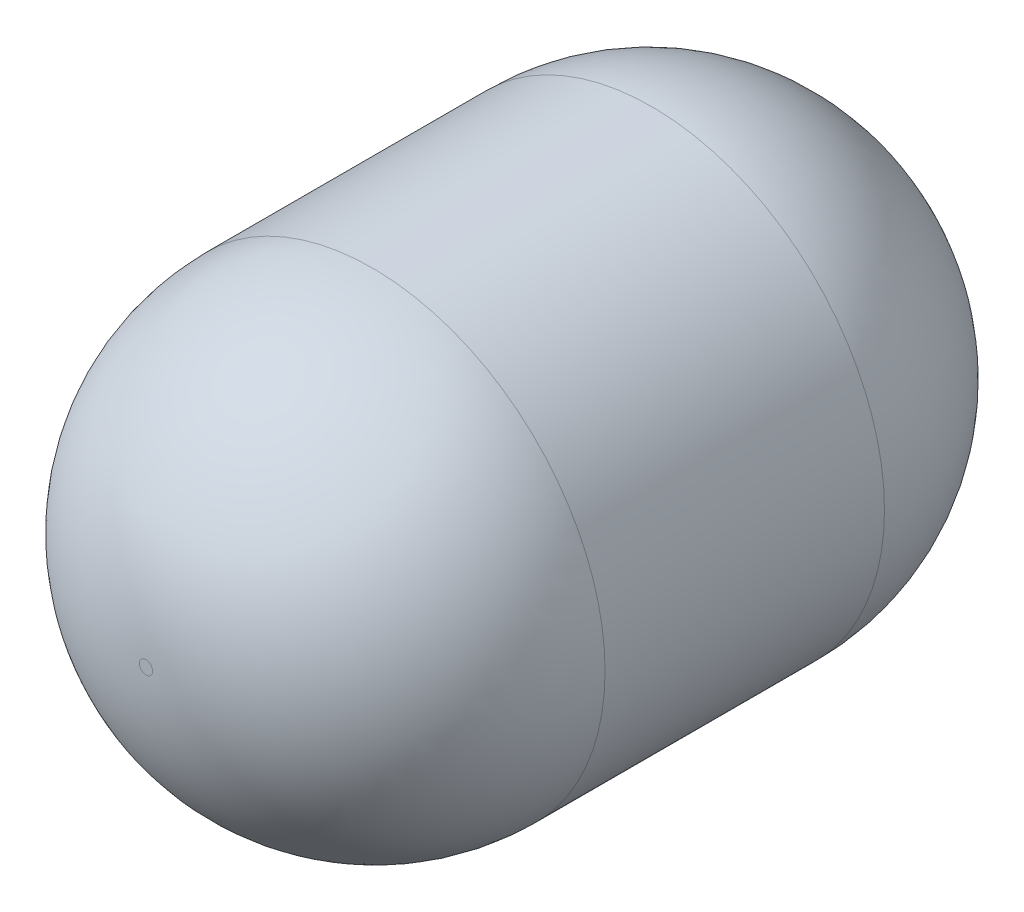
ISO-10303-21;
HEADER;
FILE_DESCRIPTION(('STEP AP214'),'2;1');
FILE_NAME('part.step','',(''),(''),'','','');
FILE_SCHEMA(('AUTOMOTIVE_DESIGN { 1 0 10303 214 1 1 1 1 }'));
ENDSEC;
DATA;
#1=APPLICATION_CONTEXT('core data for automotive mechanical design processes');
#2=APPLICATION_PROTOCOL_DEFINITION('international standard','automotive_design',2000,#1);
#3=PRODUCT_CONTEXT('',#1,'mechanical');
#4=PRODUCT('Part','Part','',(#3));
#5=PRODUCT_RELATED_PRODUCT_CATEGORY('part','',(#4));
#6=PRODUCT_DEFINITION_FORMATION('','',#4);
#7=PRODUCT_DEFINITION_CONTEXT('part definition',#1,'design');
#8=PRODUCT_DEFINITION('design','',#6,#7);
#9=PRODUCT_DEFINITION_SHAPE('','',#8);
#10=(LENGTH_UNIT() NAMED_UNIT(*) SI_UNIT(.MILLI.,.METRE.));
#11=(NAMED_UNIT(*) PLANE_ANGLE_UNIT() SI_UNIT($,.RADIAN.));
#12=(NAMED_UNIT(*) SI_UNIT($,.STERADIAN.) SOLID_ANGLE_UNIT());
#13=UNCERTAINTY_MEASURE_WITH_UNIT(LENGTH_MEASURE(1.E-05),#10,'distance_accuracy_value','');
#14=(GEOMETRIC_REPRESENTATION_CONTEXT(3) GLOBAL_UNCERTAINTY_ASSIGNED_CONTEXT((#13)) GLOBAL_UNIT_ASSIGNED_CONTEXT((#10,
#11,#12)) REPRESENTATION_CONTEXT('',''));
#15=CARTESIAN_POINT('',(0.,0.,0.));
#16=DIRECTION('',(0.,0.,1.));
#17=DIRECTION('',(1.,0.,0.));
#18=AXIS2_PLACEMENT_3D('',#15,#16,#17);
#19=CARTESIAN_POINT('',(0.,0.,110.));
#20=DIRECTION('',(0.,0.,-1.));
#21=DIRECTION('',(-1.,0.,0.));
#22=AXIS2_PLACEMENT_3D('',#19,#20,#21);
#23=CYLINDRICAL_SURFACE('',#22,35.);
#24=CARTESIAN_POINT('',(0.,0.,34.));
#25=DIRECTION('',(0.,0.,1.));
#26=DIRECTION('',(1.,0.,0.));
#27=AXIS2_PLACEMENT_3D('',#24,#25,#26);
#28=CIRCLE('',#27,35.);
#29=CARTESIAN_POINT('',(35.,0.,34.));
#30=VERTEX_POINT('',#29);
#31=EDGE_CURVE('E54',#30,#30,#28,.T.);
#32=ORIENTED_EDGE('',*,*,#31,.T.);
#33=EDGE_LOOP('',(#32));
#34=FACE_BOUND('',#33,.T.);
#35=CARTESIAN_POINT('',(0.,0.,76.));
#36=DIRECTION('',(0.,0.,1.));
#37=DIRECTION('',(1.,0.,0.));
#38=AXIS2_PLACEMENT_3D('',#35,#36,#37);
#39=CIRCLE('',#38,35.);
#40=CARTESIAN_POINT('',(35.,0.,76.));
#41=VERTEX_POINT('',#40);
#42=EDGE_CURVE('E58',#41,#41,#39,.F.);
#43=ORIENTED_EDGE('',*,*,#42,.T.);
#44=EDGE_LOOP('',(#43));
#45=FACE_BOUND('',#44,.T.);
#46=ADVANCED_FACE('F43',(#34,#45),#23,.T.);
#47=CARTESIAN_POINT('',(0.,0.,110.));
#48=DIRECTION('',(0.,0.,1.));
#49=DIRECTION('',(1.,0.,0.));
#50=AXIS2_PLACEMENT_3D('',#47,#48,#49);
#51=PLANE('',#50);
#52=CARTESIAN_POINT('',(0.,0.,110.));
#53=DIRECTION('',(0.,0.,1.));
#54=DIRECTION('',(1.,0.,0.));
#55=AXIS2_PLACEMENT_3D('',#52,#53,#54);
#56=CIRCLE('',#55,1.00000000000001);
#57=CARTESIAN_POINT('',(1.00000000000001,0.,110.));
#58=VERTEX_POINT('',#57);
#59=EDGE_CURVE('E10',#58,#58,#56,.T.);
#60=ORIENTED_EDGE('',*,*,#59,.T.);
#61=EDGE_LOOP('',(#60));
#62=FACE_BOUND('',#61,.T.);
#63=ADVANCED_FACE('F74',(#62),#51,.T.);
#64=CARTESIAN_POINT('',(0.,0.,0.));
#65=DIRECTION('',(0.,0.,1.));
#66=DIRECTION('',(1.,0.,0.));
#67=AXIS2_PLACEMENT_3D('',#64,#65,#66);
#68=PLANE('',#67);
#69=CARTESIAN_POINT('',(0.,0.,0.));
#70=DIRECTION('',(0.,0.,1.));
#71=DIRECTION('',(1.,0.,0.));
#72=AXIS2_PLACEMENT_3D('',#69,#70,#71);
#73=CIRCLE('',#72,1.00000000000001);
#74=CARTESIAN_POINT('',(1.00000000000001,0.,0.));
#75=VERTEX_POINT('',#74);
#76=EDGE_CURVE('E50',#75,#75,#73,.F.);
#77=ORIENTED_EDGE('',*,*,#76,.T.);
#78=EDGE_LOOP('',(#77));
#79=FACE_BOUND('',#78,.T.);
#80=ADVANCED_FACE('F71',(#79),#68,.F.);
#81=CARTESIAN_POINT('',(0.,0.,34.));
#82=DIRECTION('',(0.,0.,1.));
#83=DIRECTION('',(1.,0.,0.));
#84=AXIS2_PLACEMENT_3D('',#81,#82,#83);
#85=DEGENERATE_TOROIDAL_SURFACE('',#84,1.00000000000001,34.,.T.);
#86=ORIENTED_EDGE('',*,*,#76,.F.);
#87=EDGE_LOOP('',(#86));
#88=FACE_BOUND('',#87,.T.);
#89=ORIENTED_EDGE('',*,*,#31,.F.);
#90=EDGE_LOOP('',(#89));
#91=FACE_BOUND('',#90,.T.);
#92=ADVANCED_FACE('F67',(#88,#91),#85,.T.);
#93=CARTESIAN_POINT('',(0.,0.,76.));
#94=DIRECTION('',(0.,0.,1.));
#95=DIRECTION('',(1.,0.,0.));
#96=AXIS2_PLACEMENT_3D('',#93,#94,#95);
#97=DEGENERATE_TOROIDAL_SURFACE('',#96,1.00000000000001,34.,.T.);
#98=ORIENTED_EDGE('',*,*,#42,.F.);
#99=EDGE_LOOP('',(#98));
#100=FACE_BOUND('',#99,.T.);
#101=ORIENTED_EDGE('',*,*,#59,.F.);
#102=EDGE_LOOP('',(#101));
#103=FACE_BOUND('',#102,.T.);
#104=ADVANCED_FACE('F45',(#100,#103),#97,.T.);
#105=CLOSED_SHELL('',(#46,#63,#80,#92,#104));
#106=MANIFOLD_SOLID_BREP('B2',#105);
#107=ADVANCED_BREP_SHAPE_REPRESENTATION('',(#18,#106),#14);
#108=SHAPE_DEFINITION_REPRESENTATION(#9,#107);
ENDSEC;
END-ISO-10303-21;
